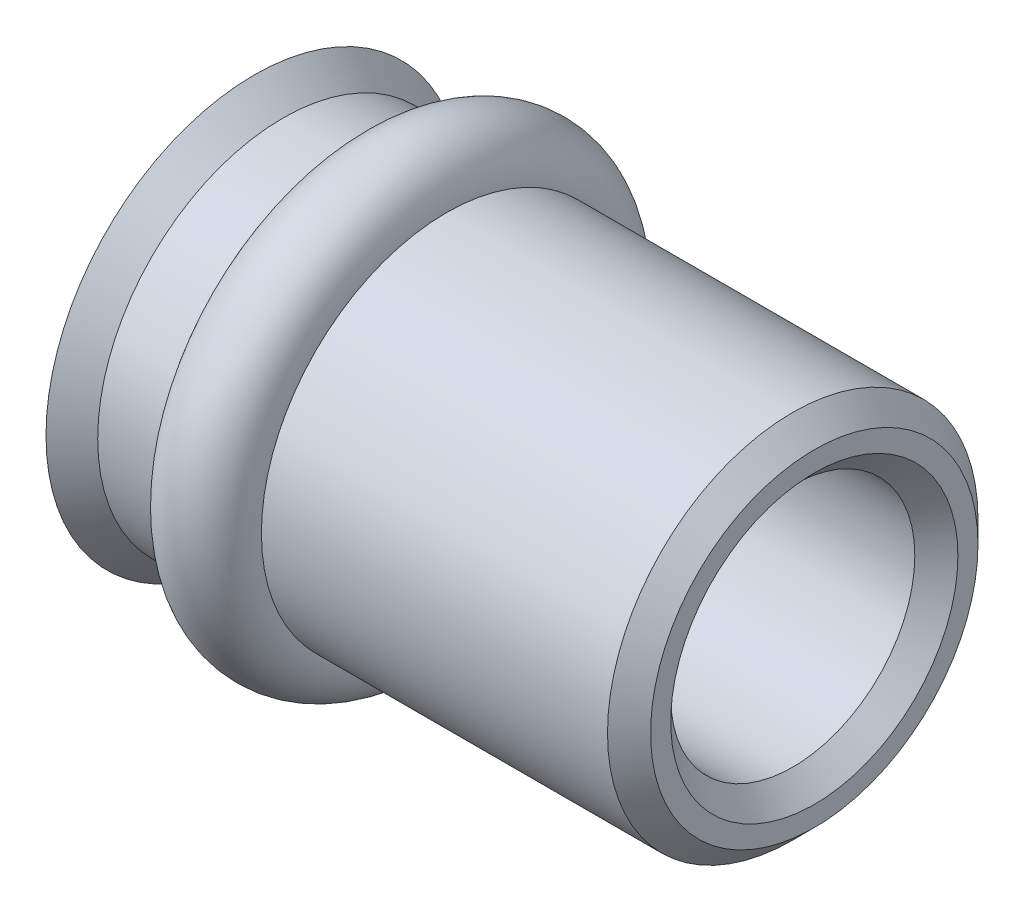
ISO-10303-21;
HEADER;
FILE_DESCRIPTION(('STEP AP214'),'2;1');
FILE_NAME('part.step','',(''),(''),'','','');
FILE_SCHEMA(('AUTOMOTIVE_DESIGN { 1 0 10303 214 1 1 1 1 }'));
ENDSEC;
DATA;
#1=APPLICATION_CONTEXT('core data for automotive mechanical design processes');
#2=APPLICATION_PROTOCOL_DEFINITION('international standard','automotive_design',2000,#1);
#3=PRODUCT_CONTEXT('',#1,'mechanical');
#4=PRODUCT('Part','Part','',(#3));
#5=PRODUCT_RELATED_PRODUCT_CATEGORY('part','',(#4));
#6=PRODUCT_DEFINITION_FORMATION('','',#4);
#7=PRODUCT_DEFINITION_CONTEXT('part definition',#1,'design');
#8=PRODUCT_DEFINITION('design','',#6,#7);
#9=PRODUCT_DEFINITION_SHAPE('','',#8);
#10=(LENGTH_UNIT() NAMED_UNIT(*) SI_UNIT(.MILLI.,.METRE.));
#11=(NAMED_UNIT(*) PLANE_ANGLE_UNIT() SI_UNIT($,.RADIAN.));
#12=(NAMED_UNIT(*) SI_UNIT($,.STERADIAN.) SOLID_ANGLE_UNIT());
#13=UNCERTAINTY_MEASURE_WITH_UNIT(LENGTH_MEASURE(1.E-05),#10,'distance_accuracy_value','');
#14=(GEOMETRIC_REPRESENTATION_CONTEXT(3) GLOBAL_UNCERTAINTY_ASSIGNED_CONTEXT((#13)) GLOBAL_UNIT_ASSIGNED_CONTEXT((#10,
#11,#12)) REPRESENTATION_CONTEXT('',''));
#15=CARTESIAN_POINT('',(0.,0.,0.));
#16=DIRECTION('',(0.,0.,1.));
#17=DIRECTION('',(1.,0.,0.));
#18=AXIS2_PLACEMENT_3D('',#15,#16,#17);
#19=CARTESIAN_POINT('',(1.,0.,0.));
#20=DIRECTION('',(-1.,0.,0.));
#21=DIRECTION('',(0.,0.,1.));
#22=AXIS2_PLACEMENT_3D('',#19,#20,#21);
#23=CONICAL_SURFACE('',#22,6.45,0.674740942223552);
#24=CARTESIAN_POINT('',(0.,0.,0.));
#25=DIRECTION('',(1.,0.,0.));
#26=DIRECTION('',(0.,0.,-1.));
#27=AXIS2_PLACEMENT_3D('',#24,#25,#26);
#28=CIRCLE('',#27,7.25);
#29=CARTESIAN_POINT('',(0.,0.,-7.25));
#30=VERTEX_POINT('',#29);
#31=EDGE_CURVE('E86',#30,#30,#28,.T.);
#32=ORIENTED_EDGE('',*,*,#31,.T.);
#33=EDGE_LOOP('',(#32));
#34=FACE_BOUND('',#33,.T.);
#35=CARTESIAN_POINT('',(1.,0.,0.));
#36=DIRECTION('',(1.,0.,0.));
#37=DIRECTION('',(0.,0.,-1.));
#38=AXIS2_PLACEMENT_3D('',#35,#36,#37);
#39=CIRCLE('',#38,6.45);
#40=CARTESIAN_POINT('',(1.,0.,-6.45));
#41=VERTEX_POINT('',#40);
#42=EDGE_CURVE('E10',#41,#41,#39,.T.);
#43=ORIENTED_EDGE('',*,*,#42,.F.);
#44=EDGE_LOOP('',(#43));
#45=FACE_BOUND('',#44,.T.);
#46=ADVANCED_FACE('F39',(#34,#45),#23,.T.);
#47=CARTESIAN_POINT('',(0.,0.,0.));
#48=DIRECTION('',(1.,0.,0.));
#49=DIRECTION('',(0.,0.,-1.));
#50=AXIS2_PLACEMENT_3D('',#47,#48,#49);
#51=CYLINDRICAL_SURFACE('',#50,6.45);
#52=ORIENTED_EDGE('',*,*,#42,.T.);
#53=EDGE_LOOP('',(#52));
#54=FACE_BOUND('',#53,.T.);
#55=CARTESIAN_POINT('',(3.5,0.,0.));
#56=DIRECTION('',(1.,0.,0.));
#57=DIRECTION('',(0.,0.,-1.));
#58=AXIS2_PLACEMENT_3D('',#55,#56,#57);
#59=CIRCLE('',#58,6.45);
#60=CARTESIAN_POINT('',(3.5,0.,-6.45));
#61=VERTEX_POINT('',#60);
#62=EDGE_CURVE('E46',#61,#61,#59,.T.);
#63=ORIENTED_EDGE('',*,*,#62,.F.);
#64=EDGE_LOOP('',(#63));
#65=FACE_BOUND('',#64,.T.);
#66=ADVANCED_FACE('F105',(#54,#65),#51,.T.);
#67=CARTESIAN_POINT('',(5.1,0.,0.));
#68=DIRECTION('',(1.,0.,0.));
#69=DIRECTION('',(0.,0.,-1.));
#70=AXIS2_PLACEMENT_3D('',#67,#68,#69);
#71=TOROIDAL_SURFACE('',#70,6.45,1.6);
#72=ORIENTED_EDGE('',*,*,#62,.T.);
#73=EDGE_LOOP('',(#72));
#74=FACE_BOUND('',#73,.T.);
#75=CARTESIAN_POINT('',(6.7,0.,0.));
#76=DIRECTION('',(1.,0.,0.));
#77=DIRECTION('',(0.,0.,-1.));
#78=AXIS2_PLACEMENT_3D('',#75,#76,#77);
#79=CIRCLE('',#78,6.45);
#80=CARTESIAN_POINT('',(6.7,0.,-6.45));
#81=VERTEX_POINT('',#80);
#82=EDGE_CURVE('E51',#81,#81,#79,.T.);
#83=ORIENTED_EDGE('',*,*,#82,.F.);
#84=EDGE_LOOP('',(#83));
#85=FACE_BOUND('',#84,.T.);
#86=ADVANCED_FACE('F109',(#74,#85),#71,.T.);
#87=CARTESIAN_POINT('',(0.,0.,0.));
#88=DIRECTION('',(1.,0.,0.));
#89=DIRECTION('',(0.,0.,-1.));
#90=AXIS2_PLACEMENT_3D('',#87,#88,#89);
#91=CYLINDRICAL_SURFACE('',#90,6.45);
#92=ORIENTED_EDGE('',*,*,#82,.T.);
#93=EDGE_LOOP('',(#92));
#94=FACE_BOUND('',#93,.T.);
#95=CARTESIAN_POINT('',(18.75,0.,0.));
#96=DIRECTION('',(1.,0.,0.));
#97=DIRECTION('',(0.,0.,-1.));
#98=AXIS2_PLACEMENT_3D('',#95,#96,#97);
#99=CIRCLE('',#98,6.45);
#100=CARTESIAN_POINT('',(18.75,0.,-6.45));
#101=VERTEX_POINT('',#100);
#102=EDGE_CURVE('E56',#101,#101,#99,.T.);
#103=ORIENTED_EDGE('',*,*,#102,.F.);
#104=EDGE_LOOP('',(#103));
#105=FACE_BOUND('',#104,.T.);
#106=ADVANCED_FACE('F113',(#94,#105),#91,.T.);
#107=CARTESIAN_POINT('',(19.5,0.,0.));
#108=DIRECTION('',(-1.,0.,0.));
#109=DIRECTION('',(0.,0.,1.));
#110=AXIS2_PLACEMENT_3D('',#107,#108,#109);
#111=CONICAL_SURFACE('',#110,5.7,0.785398163397445);
#112=ORIENTED_EDGE('',*,*,#102,.T.);
#113=EDGE_LOOP('',(#112));
#114=FACE_BOUND('',#113,.T.);
#115=CARTESIAN_POINT('',(19.5,0.,0.));
#116=DIRECTION('',(1.,0.,0.));
#117=DIRECTION('',(0.,0.,-1.));
#118=AXIS2_PLACEMENT_3D('',#115,#116,#117);
#119=CIRCLE('',#118,5.7);
#120=CARTESIAN_POINT('',(19.5,0.,-5.7));
#121=VERTEX_POINT('',#120);
#122=EDGE_CURVE('E62',#121,#121,#119,.T.);
#123=ORIENTED_EDGE('',*,*,#122,.F.);
#124=EDGE_LOOP('',(#123));
#125=FACE_BOUND('',#124,.T.);
#126=ADVANCED_FACE('F119',(#114,#125),#111,.T.);
#127=CARTESIAN_POINT('',(19.5,5.,0.));
#128=DIRECTION('',(1.,0.,0.));
#129=DIRECTION('',(0.,0.,-1.));
#130=AXIS2_PLACEMENT_3D('',#127,#128,#129);
#131=PLANE('',#130);
#132=ORIENTED_EDGE('',*,*,#122,.T.);
#133=EDGE_LOOP('',(#132));
#134=FACE_BOUND('',#133,.T.);
#135=CARTESIAN_POINT('',(19.5,0.,0.));
#136=DIRECTION('',(1.,0.,0.));
#137=DIRECTION('',(0.,0.,-1.));
#138=AXIS2_PLACEMENT_3D('',#135,#136,#137);
#139=CIRCLE('',#138,5.);
#140=CARTESIAN_POINT('',(19.5,0.,-5.));
#141=VERTEX_POINT('',#140);
#142=EDGE_CURVE('E66',#141,#141,#139,.T.);
#143=ORIENTED_EDGE('',*,*,#142,.F.);
#144=EDGE_LOOP('',(#143));
#145=FACE_BOUND('',#144,.T.);
#146=ADVANCED_FACE('F123',(#134,#145),#131,.T.);
#147=CARTESIAN_POINT('',(18.75,0.,0.));
#148=DIRECTION('',(1.,0.,0.));
#149=DIRECTION('',(0.,0.,-1.));
#150=AXIS2_PLACEMENT_3D('',#147,#148,#149);
#151=CONICAL_SURFACE('',#150,4.25,0.785398163397448);
#152=ORIENTED_EDGE('',*,*,#142,.T.);
#153=EDGE_LOOP('',(#152));
#154=FACE_BOUND('',#153,.T.);
#155=CARTESIAN_POINT('',(18.75,0.,0.));
#156=DIRECTION('',(1.,0.,0.));
#157=DIRECTION('',(0.,0.,-1.));
#158=AXIS2_PLACEMENT_3D('',#155,#156,#157);
#159=CIRCLE('',#158,4.25);
#160=CARTESIAN_POINT('',(18.75,0.,-4.25));
#161=VERTEX_POINT('',#160);
#162=EDGE_CURVE('E70',#161,#161,#159,.T.);
#163=ORIENTED_EDGE('',*,*,#162,.F.);
#164=EDGE_LOOP('',(#163));
#165=FACE_BOUND('',#164,.T.);
#166=ADVANCED_FACE('F127',(#154,#165),#151,.F.);
#167=CARTESIAN_POINT('',(0.,0.,0.));
#168=DIRECTION('',(1.,0.,0.));
#169=DIRECTION('',(0.,0.,-1.));
#170=AXIS2_PLACEMENT_3D('',#167,#168,#169);
#171=CYLINDRICAL_SURFACE('',#170,4.25);
#172=ORIENTED_EDGE('',*,*,#162,.T.);
#173=EDGE_LOOP('',(#172));
#174=FACE_BOUND('',#173,.T.);
#175=CARTESIAN_POINT('',(10.,0.,0.));
#176=DIRECTION('',(1.,0.,0.));
#177=DIRECTION('',(0.,0.,-1.));
#178=AXIS2_PLACEMENT_3D('',#175,#176,#177);
#179=CIRCLE('',#178,4.25);
#180=CARTESIAN_POINT('',(10.,0.,-4.25));
#181=VERTEX_POINT('',#180);
#182=EDGE_CURVE('E74',#181,#181,#179,.T.);
#183=ORIENTED_EDGE('',*,*,#182,.F.);
#184=EDGE_LOOP('',(#183));
#185=FACE_BOUND('',#184,.T.);
#186=ADVANCED_FACE('F131',(#174,#185),#171,.F.);
#187=CARTESIAN_POINT('',(9.,0.,0.));
#188=DIRECTION('',(-1.,0.,0.));
#189=DIRECTION('',(0.,0.,1.));
#190=AXIS2_PLACEMENT_3D('',#187,#188,#189);
#191=CONICAL_SURFACE('',#190,5.25,0.78539816339745);
#192=ORIENTED_EDGE('',*,*,#182,.T.);
#193=EDGE_LOOP('',(#192));
#194=FACE_BOUND('',#193,.T.);
#195=CARTESIAN_POINT('',(9.,0.,0.));
#196=DIRECTION('',(1.,0.,0.));
#197=DIRECTION('',(0.,0.,-1.));
#198=AXIS2_PLACEMENT_3D('',#195,#196,#197);
#199=CIRCLE('',#198,5.25);
#200=CARTESIAN_POINT('',(9.,0.,-5.25));
#201=VERTEX_POINT('',#200);
#202=EDGE_CURVE('E78',#201,#201,#199,.T.);
#203=ORIENTED_EDGE('',*,*,#202,.F.);
#204=EDGE_LOOP('',(#203));
#205=FACE_BOUND('',#204,.T.);
#206=ADVANCED_FACE('F101',(#194,#205),#191,.F.);
#207=CARTESIAN_POINT('',(0.,0.,0.));
#208=DIRECTION('',(1.,0.,0.));
#209=DIRECTION('',(0.,0.,-1.));
#210=AXIS2_PLACEMENT_3D('',#207,#208,#209);
#211=CYLINDRICAL_SURFACE('',#210,5.25);
#212=ORIENTED_EDGE('',*,*,#202,.T.);
#213=EDGE_LOOP('',(#212));
#214=FACE_BOUND('',#213,.T.);
#215=CARTESIAN_POINT('',(0.,0.,0.));
#216=DIRECTION('',(1.,0.,0.));
#217=DIRECTION('',(0.,0.,-1.));
#218=AXIS2_PLACEMENT_3D('',#215,#216,#217);
#219=CIRCLE('',#218,5.25);
#220=CARTESIAN_POINT('',(0.,0.,-5.25));
#221=VERTEX_POINT('',#220);
#222=EDGE_CURVE('E82',#221,#221,#219,.T.);
#223=ORIENTED_EDGE('',*,*,#222,.F.);
#224=EDGE_LOOP('',(#223));
#225=FACE_BOUND('',#224,.T.);
#226=ADVANCED_FACE('F95',(#214,#225),#211,.F.);
#227=CARTESIAN_POINT('',(0.,7.25,0.));
#228=DIRECTION('',(-1.,0.,0.));
#229=DIRECTION('',(0.,0.,1.));
#230=AXIS2_PLACEMENT_3D('',#227,#228,#229);
#231=PLANE('',#230);
#232=ORIENTED_EDGE('',*,*,#222,.T.);
#233=EDGE_LOOP('',(#232));
#234=FACE_BOUND('',#233,.T.);
#235=ORIENTED_EDGE('',*,*,#31,.F.);
#236=EDGE_LOOP('',(#235));
#237=FACE_BOUND('',#236,.T.);
#238=ADVANCED_FACE('F93',(#234,#237),#231,.T.);
#239=CLOSED_SHELL('',(#46,#66,#86,#106,#126,#146,#166,#186,#206,#226,#238));
#240=MANIFOLD_SOLID_BREP('B2',#239);
#241=ADVANCED_BREP_SHAPE_REPRESENTATION('',(#18,#240),#14);
#242=SHAPE_DEFINITION_REPRESENTATION(#9,#241);
ENDSEC;
END-ISO-10303-21;
